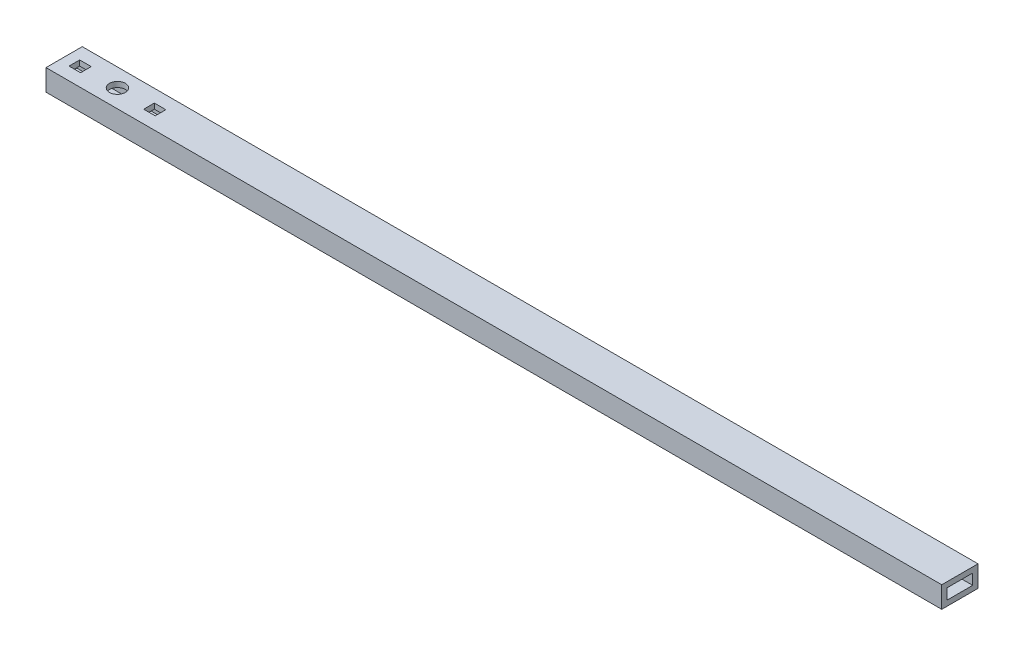
ISO-10303-21;
HEADER;
FILE_DESCRIPTION(('STEP AP214'),'2;1');
FILE_NAME('part.step','',(''),(''),'','','');
FILE_SCHEMA(('AUTOMOTIVE_DESIGN { 1 0 10303 214 1 1 1 1 }'));
ENDSEC;
DATA;
#1=APPLICATION_CONTEXT('core data for automotive mechanical design processes');
#2=APPLICATION_PROTOCOL_DEFINITION('international standard','automotive_design',2000,#1);
#3=PRODUCT_CONTEXT('',#1,'mechanical');
#4=PRODUCT('Part','Part','',(#3));
#5=PRODUCT_RELATED_PRODUCT_CATEGORY('part','',(#4));
#6=PRODUCT_DEFINITION_FORMATION('','',#4);
#7=PRODUCT_DEFINITION_CONTEXT('part definition',#1,'design');
#8=PRODUCT_DEFINITION('design','',#6,#7);
#9=PRODUCT_DEFINITION_SHAPE('','',#8);
#10=(LENGTH_UNIT() NAMED_UNIT(*) SI_UNIT(.MILLI.,.METRE.));
#11=(NAMED_UNIT(*) PLANE_ANGLE_UNIT() SI_UNIT($,.RADIAN.));
#12=(NAMED_UNIT(*) SI_UNIT($,.STERADIAN.) SOLID_ANGLE_UNIT());
#13=UNCERTAINTY_MEASURE_WITH_UNIT(LENGTH_MEASURE(1.E-05),#10,'distance_accuracy_value','');
#14=(GEOMETRIC_REPRESENTATION_CONTEXT(3) GLOBAL_UNCERTAINTY_ASSIGNED_CONTEXT((#13)) GLOBAL_UNIT_ASSIGNED_CONTEXT((#10,
#11,#12)) REPRESENTATION_CONTEXT('',''));
#15=CARTESIAN_POINT('',(0.,0.,0.));
#16=DIRECTION('',(0.,0.,1.));
#17=DIRECTION('',(1.,0.,0.));
#18=AXIS2_PLACEMENT_3D('',#15,#16,#17);
#19=CARTESIAN_POINT('',(0.,0.,0.));
#20=DIRECTION('',(-1.,0.,0.));
#21=DIRECTION('',(0.,0.,1.));
#22=AXIS2_PLACEMENT_3D('',#19,#20,#21);
#23=PLANE('',#22);
#24=DIRECTION('',(0.,1.,0.));
#25=VECTOR('',#24,1.);
#26=CARTESIAN_POINT('',(0.,-6.35,-10.795));
#27=LINE('',#26,#25);
#28=CARTESIAN_POINT('',(0.,-6.35,-10.795));
#29=VERTEX_POINT('',#28);
#30=CARTESIAN_POINT('',(0.,6.35,-10.795));
#31=VERTEX_POINT('',#30);
#32=EDGE_CURVE('E331',#29,#31,#27,.T.);
#33=ORIENTED_EDGE('',*,*,#32,.F.);
#34=DIRECTION('',(0.,0.,-1.));
#35=VECTOR('',#34,1.);
#36=CARTESIAN_POINT('',(0.,-6.35,10.795));
#37=LINE('',#36,#35);
#38=CARTESIAN_POINT('',(0.,-6.35,10.795));
#39=VERTEX_POINT('',#38);
#40=EDGE_CURVE('E339',#39,#29,#37,.T.);
#41=ORIENTED_EDGE('',*,*,#40,.F.);
#42=DIRECTION('',(0.,-1.,0.));
#43=VECTOR('',#42,1.);
#44=CARTESIAN_POINT('',(0.,-6.35,10.795));
#45=LINE('',#44,#43);
#46=CARTESIAN_POINT('',(0.,6.35,10.795));
#47=VERTEX_POINT('',#46);
#48=EDGE_CURVE('E343',#47,#39,#45,.T.);
#49=ORIENTED_EDGE('',*,*,#48,.F.);
#50=DIRECTION('',(0.,0.,1.));
#51=VECTOR('',#50,1.);
#52=CARTESIAN_POINT('',(0.,6.35,10.795));
#53=LINE('',#52,#51);
#54=EDGE_CURVE('E222',#31,#47,#53,.T.);
#55=ORIENTED_EDGE('',*,*,#54,.F.);
#56=EDGE_LOOP('',(#33,#41,#49,#55));
#57=FACE_BOUND('',#56,.T.);
#58=DIRECTION('',(0.,-1.,0.));
#59=VECTOR('',#58,1.);
#60=CARTESIAN_POINT('',(0.,-3.175,7.62));
#61=LINE('',#60,#59);
#62=CARTESIAN_POINT('',(0.,3.175,7.62));
#63=VERTEX_POINT('',#62);
#64=CARTESIAN_POINT('',(0.,-3.175,7.62));
#65=VERTEX_POINT('',#64);
#66=EDGE_CURVE('E320',#63,#65,#61,.T.);
#67=ORIENTED_EDGE('',*,*,#66,.T.);
#68=DIRECTION('',(0.,0.,-1.));
#69=VECTOR('',#68,1.);
#70=CARTESIAN_POINT('',(0.,-3.175,7.62));
#71=LINE('',#70,#69);
#72=CARTESIAN_POINT('',(0.,-3.175,-7.62));
#73=VERTEX_POINT('',#72);
#74=EDGE_CURVE('E311',#65,#73,#71,.T.);
#75=ORIENTED_EDGE('',*,*,#74,.T.);
#76=DIRECTION('',(0.,1.,0.));
#77=VECTOR('',#76,1.);
#78=CARTESIAN_POINT('',(0.,-3.175,-7.62));
#79=LINE('',#78,#77);
#80=CARTESIAN_POINT('',(0.,3.175,-7.62));
#81=VERTEX_POINT('',#80);
#82=EDGE_CURVE('E314',#73,#81,#79,.T.);
#83=ORIENTED_EDGE('',*,*,#82,.T.);
#84=DIRECTION('',(0.,0.,1.));
#85=VECTOR('',#84,1.);
#86=CARTESIAN_POINT('',(0.,3.175,7.62));
#87=LINE('',#86,#85);
#88=EDGE_CURVE('E317',#81,#63,#87,.T.);
#89=ORIENTED_EDGE('',*,*,#88,.T.);
#90=EDGE_LOOP('',(#67,#75,#83,#89));
#91=FACE_BOUND('',#90,.T.);
#92=ADVANCED_FACE('F45',(#57,#91),#23,.T.);
#93=CARTESIAN_POINT('',(596.9,-6.35,-10.795));
#94=DIRECTION('',(0.,0.,1.));
#95=DIRECTION('',(1.,0.,0.));
#96=AXIS2_PLACEMENT_3D('',#93,#94,#95);
#97=PLANE('',#96);
#98=DIRECTION('',(-1.,0.,0.));
#99=VECTOR('',#98,1.);
#100=CARTESIAN_POINT('',(596.9,6.35,-10.795));
#101=LINE('',#100,#99);
#102=CARTESIAN_POINT('',(533.4,6.35,-10.795));
#103=VERTEX_POINT('',#102);
#104=EDGE_CURVE('E224',#103,#31,#101,.T.);
#105=ORIENTED_EDGE('',*,*,#104,.F.);
#106=DIRECTION('',(0.,-1.,0.));
#107=VECTOR('',#106,1.);
#108=CARTESIAN_POINT('',(533.4,6.35,-10.795));
#109=LINE('',#108,#107);
#110=CARTESIAN_POINT('',(533.4,-6.35,-10.795));
#111=VERTEX_POINT('',#110);
#112=EDGE_CURVE('E206',#103,#111,#109,.T.);
#113=ORIENTED_EDGE('',*,*,#112,.T.);
#114=DIRECTION('',(-1.,0.,0.));
#115=VECTOR('',#114,1.);
#116=CARTESIAN_POINT('',(596.9,-6.35,-10.795));
#117=LINE('',#116,#115);
#118=EDGE_CURVE('E228',#111,#29,#117,.T.);
#119=ORIENTED_EDGE('',*,*,#118,.T.);
#120=ORIENTED_EDGE('',*,*,#32,.T.);
#121=EDGE_LOOP('',(#105,#113,#119,#120));
#122=FACE_BOUND('',#121,.T.);
#123=ADVANCED_FACE('F47',(#122),#97,.F.);
#124=CARTESIAN_POINT('',(596.9,6.35,10.795));
#125=DIRECTION('',(0.,-1.,0.));
#126=DIRECTION('',(0.,0.,-1.));
#127=AXIS2_PLACEMENT_3D('',#124,#125,#126);
#128=PLANE('',#127);
#129=DIRECTION('',(1.,0.,0.));
#130=VECTOR('',#129,1.);
#131=CARTESIAN_POINT('',(50.546,6.35,-3.175));
#132=LINE('',#131,#130);
#133=CARTESIAN_POINT('',(50.546,6.35,-3.175));
#134=VERTEX_POINT('',#133);
#135=CARTESIAN_POINT('',(57.404,6.35,-3.175));
#136=VERTEX_POINT('',#135);
#137=EDGE_CURVE('E425',#134,#136,#132,.T.);
#138=ORIENTED_EDGE('',*,*,#137,.T.);
#139=DIRECTION('',(0.,0.,1.));
#140=VECTOR('',#139,1.);
#141=CARTESIAN_POINT('',(57.404,6.35,-3.175));
#142=LINE('',#141,#140);
#143=CARTESIAN_POINT('',(57.404,6.35,3.175));
#144=VERTEX_POINT('',#143);
#145=EDGE_CURVE('E418',#136,#144,#142,.T.);
#146=ORIENTED_EDGE('',*,*,#145,.T.);
#147=DIRECTION('',(-1.,0.,0.));
#148=VECTOR('',#147,1.);
#149=CARTESIAN_POINT('',(50.546,6.35,3.175));
#150=LINE('',#149,#148);
#151=CARTESIAN_POINT('',(50.546,6.35,3.175));
#152=VERTEX_POINT('',#151);
#153=EDGE_CURVE('E421',#144,#152,#150,.T.);
#154=ORIENTED_EDGE('',*,*,#153,.T.);
#155=DIRECTION('',(0.,0.,-1.));
#156=VECTOR('',#155,1.);
#157=CARTESIAN_POINT('',(50.546,6.35,-3.175));
#158=LINE('',#157,#156);
#159=EDGE_CURVE('E275',#152,#134,#158,.T.);
#160=ORIENTED_EDGE('',*,*,#159,.T.);
#161=EDGE_LOOP('',(#138,#146,#154,#160));
#162=FACE_BOUND('',#161,.T.);
#163=DIRECTION('',(1.,0.,0.));
#164=VECTOR('',#163,1.);
#165=CARTESIAN_POINT('',(6.096,6.35,-3.175));
#166=LINE('',#165,#164);
#167=CARTESIAN_POINT('',(6.096,6.35,-3.175));
#168=VERTEX_POINT('',#167);
#169=CARTESIAN_POINT('',(12.954,6.35,-3.175));
#170=VERTEX_POINT('',#169);
#171=EDGE_CURVE('E391',#168,#170,#166,.T.);
#172=ORIENTED_EDGE('',*,*,#171,.T.);
#173=DIRECTION('',(0.,0.,1.));
#174=VECTOR('',#173,1.);
#175=CARTESIAN_POINT('',(12.954,6.35,-3.175));
#176=LINE('',#175,#174);
#177=CARTESIAN_POINT('',(12.954,6.35,3.175));
#178=VERTEX_POINT('',#177);
#179=EDGE_CURVE('E381',#170,#178,#176,.T.);
#180=ORIENTED_EDGE('',*,*,#179,.T.);
#181=DIRECTION('',(-1.,0.,0.));
#182=VECTOR('',#181,1.);
#183=CARTESIAN_POINT('',(6.096,6.35,3.175));
#184=LINE('',#183,#182);
#185=CARTESIAN_POINT('',(6.09599999999999,6.35,3.175));
#186=VERTEX_POINT('',#185);
#187=EDGE_CURVE('E384',#178,#186,#184,.T.);
#188=ORIENTED_EDGE('',*,*,#187,.T.);
#189=DIRECTION('',(0.,0.,-1.));
#190=VECTOR('',#189,1.);
#191=CARTESIAN_POINT('',(6.096,6.35,-3.175));
#192=LINE('',#191,#190);
#193=EDGE_CURVE('E388',#186,#168,#192,.T.);
#194=ORIENTED_EDGE('',*,*,#193,.T.);
#195=EDGE_LOOP('',(#172,#180,#188,#194));
#196=FACE_BOUND('',#195,.T.);
#197=CARTESIAN_POINT('',(31.75,6.35,0.));
#198=DIRECTION('',(0.,-1.,0.));
#199=DIRECTION('',(0.,0.,-1.));
#200=AXIS2_PLACEMENT_3D('',#197,#198,#199);
#201=CIRCLE('',#200,4.7244);
#202=CARTESIAN_POINT('',(31.75,6.35,-4.7244));
#203=VERTEX_POINT('',#202);
#204=EDGE_CURVE('E236',#203,#203,#201,.T.);
#205=ORIENTED_EDGE('',*,*,#204,.T.);
#206=EDGE_LOOP('',(#205));
#207=FACE_BOUND('',#206,.T.);
#208=DIRECTION('',(-1.,0.,0.));
#209=VECTOR('',#208,1.);
#210=CARTESIAN_POINT('',(596.9,6.35,10.795));
#211=LINE('',#210,#209);
#212=CARTESIAN_POINT('',(533.4,6.35,10.795));
#213=VERTEX_POINT('',#212);
#214=EDGE_CURVE('E216',#213,#47,#211,.T.);
#215=ORIENTED_EDGE('',*,*,#214,.F.);
#216=DIRECTION('',(0.,0.,-1.));
#217=VECTOR('',#216,1.);
#218=CARTESIAN_POINT('',(533.4,6.35,-10.795));
#219=LINE('',#218,#217);
#220=EDGE_CURVE('E203',#213,#103,#219,.T.);
#221=ORIENTED_EDGE('',*,*,#220,.T.);
#222=ORIENTED_EDGE('',*,*,#104,.T.);
#223=ORIENTED_EDGE('',*,*,#54,.T.);
#224=EDGE_LOOP('',(#215,#221,#222,#223));
#225=FACE_BOUND('',#224,.T.);
#226=ADVANCED_FACE('F220',(#162,#196,#207,#225),#128,.F.);
#227=CARTESIAN_POINT('',(596.9,-6.35,10.795));
#228=DIRECTION('',(0.,0.,-1.));
#229=DIRECTION('',(-1.,0.,0.));
#230=AXIS2_PLACEMENT_3D('',#227,#228,#229);
#231=PLANE('',#230);
#232=DIRECTION('',(-1.,0.,0.));
#233=VECTOR('',#232,1.);
#234=CARTESIAN_POINT('',(596.9,-6.35,10.795));
#235=LINE('',#234,#233);
#236=CARTESIAN_POINT('',(533.4,-6.35,10.795));
#237=VERTEX_POINT('',#236);
#238=EDGE_CURVE('E218',#237,#39,#235,.T.);
#239=ORIENTED_EDGE('',*,*,#238,.F.);
#240=DIRECTION('',(0.,-1.,0.));
#241=VECTOR('',#240,1.);
#242=CARTESIAN_POINT('',(533.4,6.35,10.795));
#243=LINE('',#242,#241);
#244=EDGE_CURVE('E60',#213,#237,#243,.T.);
#245=ORIENTED_EDGE('',*,*,#244,.F.);
#246=ORIENTED_EDGE('',*,*,#214,.T.);
#247=ORIENTED_EDGE('',*,*,#48,.T.);
#248=EDGE_LOOP('',(#239,#245,#246,#247));
#249=FACE_BOUND('',#248,.T.);
#250=ADVANCED_FACE('F214',(#249),#231,.F.);
#251=CARTESIAN_POINT('',(596.9,-6.35,10.795));
#252=DIRECTION('',(0.,1.,0.));
#253=DIRECTION('',(0.,0.,1.));
#254=AXIS2_PLACEMENT_3D('',#251,#252,#253);
#255=PLANE('',#254);
#256=DIRECTION('',(-1.,0.,0.));
#257=VECTOR('',#256,1.);
#258=CARTESIAN_POINT('',(50.546,-6.35,3.175));
#259=LINE('',#258,#257);
#260=CARTESIAN_POINT('',(57.404,-6.35,3.175));
#261=VERTEX_POINT('',#260);
#262=CARTESIAN_POINT('',(50.546,-6.35,3.175));
#263=VERTEX_POINT('',#262);
#264=EDGE_CURVE('E429',#261,#263,#259,.T.);
#265=ORIENTED_EDGE('',*,*,#264,.F.);
#266=DIRECTION('',(0.,0.,1.));
#267=VECTOR('',#266,1.);
#268=CARTESIAN_POINT('',(57.404,-6.35,-3.175));
#269=LINE('',#268,#267);
#270=CARTESIAN_POINT('',(57.404,-6.35,-3.175));
#271=VERTEX_POINT('',#270);
#272=EDGE_CURVE('E380',#271,#261,#269,.T.);
#273=ORIENTED_EDGE('',*,*,#272,.F.);
#274=DIRECTION('',(1.,0.,0.));
#275=VECTOR('',#274,1.);
#276=CARTESIAN_POINT('',(50.546,-6.35,-3.175));
#277=LINE('',#276,#275);
#278=CARTESIAN_POINT('',(50.546,-6.35,-3.175));
#279=VERTEX_POINT('',#278);
#280=EDGE_CURVE('E422',#279,#271,#277,.T.);
#281=ORIENTED_EDGE('',*,*,#280,.F.);
#282=DIRECTION('',(0.,0.,-1.));
#283=VECTOR('',#282,1.);
#284=CARTESIAN_POINT('',(50.546,-6.35,-3.175));
#285=LINE('',#284,#283);
#286=EDGE_CURVE('E432',#263,#279,#285,.T.);
#287=ORIENTED_EDGE('',*,*,#286,.F.);
#288=EDGE_LOOP('',(#265,#273,#281,#287));
#289=FACE_BOUND('',#288,.T.);
#290=DIRECTION('',(-1.,0.,0.));
#291=VECTOR('',#290,1.);
#292=CARTESIAN_POINT('',(6.096,-6.35,3.175));
#293=LINE('',#292,#291);
#294=CARTESIAN_POINT('',(12.954,-6.35,3.175));
#295=VERTEX_POINT('',#294);
#296=CARTESIAN_POINT('',(6.096,-6.35,3.175));
#297=VERTEX_POINT('',#296);
#298=EDGE_CURVE('E397',#295,#297,#293,.T.);
#299=ORIENTED_EDGE('',*,*,#298,.F.);
#300=DIRECTION('',(0.,0.,1.));
#301=VECTOR('',#300,1.);
#302=CARTESIAN_POINT('',(12.954,-6.35,-3.175));
#303=LINE('',#302,#301);
#304=CARTESIAN_POINT('',(12.954,-6.35,-3.175));
#305=VERTEX_POINT('',#304);
#306=EDGE_CURVE('E395',#305,#295,#303,.T.);
#307=ORIENTED_EDGE('',*,*,#306,.F.);
#308=DIRECTION('',(1.,0.,0.));
#309=VECTOR('',#308,1.);
#310=CARTESIAN_POINT('',(6.096,-6.35,-3.175));
#311=LINE('',#310,#309);
#312=CARTESIAN_POINT('',(6.096,-6.35,-3.175));
#313=VERTEX_POINT('',#312);
#314=EDGE_CURVE('E385',#313,#305,#311,.T.);
#315=ORIENTED_EDGE('',*,*,#314,.F.);
#316=DIRECTION('',(0.,0.,-1.));
#317=VECTOR('',#316,1.);
#318=CARTESIAN_POINT('',(6.096,-6.35,-3.175));
#319=LINE('',#318,#317);
#320=EDGE_CURVE('E400',#297,#313,#319,.T.);
#321=ORIENTED_EDGE('',*,*,#320,.F.);
#322=EDGE_LOOP('',(#299,#307,#315,#321));
#323=FACE_BOUND('',#322,.T.);
#324=CARTESIAN_POINT('',(31.75,-6.35,0.));
#325=DIRECTION('',(0.,-1.,0.));
#326=DIRECTION('',(0.,0.,-1.));
#327=AXIS2_PLACEMENT_3D('',#324,#325,#326);
#328=CIRCLE('',#327,4.7244);
#329=CARTESIAN_POINT('',(31.75,-6.35,-4.7244));
#330=VERTEX_POINT('',#329);
#331=EDGE_CURVE('E287',#330,#330,#328,.T.);
#332=ORIENTED_EDGE('',*,*,#331,.F.);
#333=EDGE_LOOP('',(#332));
#334=FACE_BOUND('',#333,.T.);
#335=ORIENTED_EDGE('',*,*,#118,.F.);
#336=DIRECTION('',(0.,0.,-1.));
#337=VECTOR('',#336,1.);
#338=CARTESIAN_POINT('',(533.4,-6.35,-10.795));
#339=LINE('',#338,#337);
#340=EDGE_CURVE('E210',#237,#111,#339,.T.);
#341=ORIENTED_EDGE('',*,*,#340,.F.);
#342=ORIENTED_EDGE('',*,*,#238,.T.);
#343=ORIENTED_EDGE('',*,*,#40,.T.);
#344=EDGE_LOOP('',(#335,#341,#342,#343));
#345=FACE_BOUND('',#344,.T.);
#346=ADVANCED_FACE('F349',(#289,#323,#334,#345),#255,.F.);
#347=CARTESIAN_POINT('',(596.9,-3.175,7.62));
#348=DIRECTION('',(0.,1.,0.));
#349=DIRECTION('',(0.,0.,1.));
#350=AXIS2_PLACEMENT_3D('',#347,#348,#349);
#351=PLANE('',#350);
#352=DIRECTION('',(0.,0.,1.));
#353=VECTOR('',#352,1.);
#354=CARTESIAN_POINT('',(533.4,-3.175,7.62));
#355=LINE('',#354,#353);
#356=CARTESIAN_POINT('',(533.4,-3.175,-7.62));
#357=VERTEX_POINT('',#356);
#358=CARTESIAN_POINT('',(533.4,-3.175,7.62));
#359=VERTEX_POINT('',#358);
#360=EDGE_CURVE('E67',#357,#359,#355,.T.);
#361=ORIENTED_EDGE('',*,*,#360,.F.);
#362=DIRECTION('',(-1.,0.,0.));
#363=VECTOR('',#362,1.);
#364=CARTESIAN_POINT('',(596.9,-3.175,-7.62));
#365=LINE('',#364,#363);
#366=EDGE_CURVE('E329',#357,#73,#365,.T.);
#367=ORIENTED_EDGE('',*,*,#366,.T.);
#368=ORIENTED_EDGE('',*,*,#74,.F.);
#369=DIRECTION('',(-1.,0.,0.));
#370=VECTOR('',#369,1.);
#371=CARTESIAN_POINT('',(596.9,-3.175,7.62));
#372=LINE('',#371,#370);
#373=EDGE_CURVE('E323',#359,#65,#372,.T.);
#374=ORIENTED_EDGE('',*,*,#373,.F.);
#375=EDGE_LOOP('',(#361,#367,#368,#374));
#376=FACE_BOUND('',#375,.T.);
#377=DIRECTION('',(0.,0.,-1.));
#378=VECTOR('',#377,1.);
#379=CARTESIAN_POINT('',(57.404,-3.175,7.62));
#380=LINE('',#379,#378);
#381=CARTESIAN_POINT('',(57.404,-3.175,3.175));
#382=VERTEX_POINT('',#381);
#383=CARTESIAN_POINT('',(57.404,-3.175,-3.175));
#384=VERTEX_POINT('',#383);
#385=EDGE_CURVE('E309',#382,#384,#380,.T.);
#386=ORIENTED_EDGE('',*,*,#385,.F.);
#387=DIRECTION('',(1.,0.,0.));
#388=VECTOR('',#387,1.);
#389=CARTESIAN_POINT('',(596.9,-3.175,3.17499999999997));
#390=LINE('',#389,#388);
#391=CARTESIAN_POINT('',(50.546,-3.175,3.175));
#392=VERTEX_POINT('',#391);
#393=EDGE_CURVE('E302',#392,#382,#390,.T.);
#394=ORIENTED_EDGE('',*,*,#393,.F.);
#395=DIRECTION('',(0.,0.,1.));
#396=VECTOR('',#395,1.);
#397=CARTESIAN_POINT('',(50.546,-3.175,7.62));
#398=LINE('',#397,#396);
#399=CARTESIAN_POINT('',(50.546,-3.175,-3.175));
#400=VERTEX_POINT('',#399);
#401=EDGE_CURVE('E304',#400,#392,#398,.T.);
#402=ORIENTED_EDGE('',*,*,#401,.F.);
#403=DIRECTION('',(-1.,0.,0.));
#404=VECTOR('',#403,1.);
#405=CARTESIAN_POINT('',(596.9,-3.175,-3.17499999999997));
#406=LINE('',#405,#404);
#407=EDGE_CURVE('E307',#384,#400,#406,.T.);
#408=ORIENTED_EDGE('',*,*,#407,.F.);
#409=EDGE_LOOP('',(#386,#394,#402,#408));
#410=FACE_BOUND('',#409,.T.);
#411=DIRECTION('',(0.,0.,-1.));
#412=VECTOR('',#411,1.);
#413=CARTESIAN_POINT('',(12.954,-3.175,7.62));
#414=LINE('',#413,#412);
#415=CARTESIAN_POINT('',(12.954,-3.175,3.175));
#416=VERTEX_POINT('',#415);
#417=CARTESIAN_POINT('',(12.954,-3.175,-3.175));
#418=VERTEX_POINT('',#417);
#419=EDGE_CURVE('E300',#416,#418,#414,.T.);
#420=ORIENTED_EDGE('',*,*,#419,.F.);
#421=DIRECTION('',(1.,0.,0.));
#422=VECTOR('',#421,1.);
#423=CARTESIAN_POINT('',(596.9,-3.175,3.17500000000011));
#424=LINE('',#423,#422);
#425=CARTESIAN_POINT('',(6.09599999999999,-3.175,3.175));
#426=VERTEX_POINT('',#425);
#427=EDGE_CURVE('E293',#426,#416,#424,.T.);
#428=ORIENTED_EDGE('',*,*,#427,.F.);
#429=DIRECTION('',(0.,0.,1.));
#430=VECTOR('',#429,1.);
#431=CARTESIAN_POINT('',(6.09599999999999,-3.175,7.62));
#432=LINE('',#431,#430);
#433=CARTESIAN_POINT('',(6.096,-3.175,-3.175));
#434=VERTEX_POINT('',#433);
#435=EDGE_CURVE('E295',#434,#426,#432,.T.);
#436=ORIENTED_EDGE('',*,*,#435,.F.);
#437=DIRECTION('',(-1.,0.,0.));
#438=VECTOR('',#437,1.);
#439=CARTESIAN_POINT('',(596.9,-3.175,-3.17499999999996));
#440=LINE('',#439,#438);
#441=EDGE_CURVE('E298',#418,#434,#440,.T.);
#442=ORIENTED_EDGE('',*,*,#441,.F.);
#443=EDGE_LOOP('',(#420,#428,#436,#442));
#444=FACE_BOUND('',#443,.T.);
#445=CARTESIAN_POINT('',(31.75,-3.175,0.));
#446=DIRECTION('',(0.,1.,0.));
#447=DIRECTION('',(0.,0.,1.));
#448=AXIS2_PLACEMENT_3D('',#445,#446,#447);
#449=CIRCLE('',#448,4.7244);
#450=CARTESIAN_POINT('',(31.75,-3.175,4.7244));
#451=VERTEX_POINT('',#450);
#452=EDGE_CURVE('E235',#451,#451,#449,.T.);
#453=ORIENTED_EDGE('',*,*,#452,.F.);
#454=EDGE_LOOP('',(#453));
#455=FACE_BOUND('',#454,.T.);
#456=ADVANCED_FACE('F363',(#376,#410,#444,#455),#351,.T.);
#457=CARTESIAN_POINT('',(596.9,-3.175,-7.62));
#458=DIRECTION('',(0.,0.,1.));
#459=DIRECTION('',(0.,-1.,0.));
#460=AXIS2_PLACEMENT_3D('',#457,#458,#459);
#461=PLANE('',#460);
#462=DIRECTION('',(0.,-1.,0.));
#463=VECTOR('',#462,1.);
#464=CARTESIAN_POINT('',(533.4,-3.175,-7.62));
#465=LINE('',#464,#463);
#466=CARTESIAN_POINT('',(533.4,3.175,-7.62));
#467=VERTEX_POINT('',#466);
#468=EDGE_CURVE('E371',#467,#357,#465,.T.);
#469=ORIENTED_EDGE('',*,*,#468,.F.);
#470=DIRECTION('',(-1.,0.,0.));
#471=VECTOR('',#470,1.);
#472=CARTESIAN_POINT('',(596.9,3.175,-7.62));
#473=LINE('',#472,#471);
#474=EDGE_CURVE('E327',#467,#81,#473,.T.);
#475=ORIENTED_EDGE('',*,*,#474,.T.);
#476=ORIENTED_EDGE('',*,*,#82,.F.);
#477=ORIENTED_EDGE('',*,*,#366,.F.);
#478=EDGE_LOOP('',(#469,#475,#476,#477));
#479=FACE_BOUND('',#478,.T.);
#480=ADVANCED_FACE('F369',(#479),#461,.T.);
#481=CARTESIAN_POINT('',(596.9,3.175,7.62));
#482=DIRECTION('',(0.,-1.,0.));
#483=DIRECTION('',(0.,0.,-1.));
#484=AXIS2_PLACEMENT_3D('',#481,#482,#483);
#485=PLANE('',#484);
#486=DIRECTION('',(0.,0.,-1.));
#487=VECTOR('',#486,1.);
#488=CARTESIAN_POINT('',(533.4,3.175,7.62));
#489=LINE('',#488,#487);
#490=CARTESIAN_POINT('',(533.4,3.175,7.62));
#491=VERTEX_POINT('',#490);
#492=EDGE_CURVE('E374',#491,#467,#489,.T.);
#493=ORIENTED_EDGE('',*,*,#492,.F.);
#494=DIRECTION('',(-1.,0.,0.));
#495=VECTOR('',#494,1.);
#496=CARTESIAN_POINT('',(596.9,3.175,7.62));
#497=LINE('',#496,#495);
#498=EDGE_CURVE('E325',#491,#63,#497,.T.);
#499=ORIENTED_EDGE('',*,*,#498,.T.);
#500=ORIENTED_EDGE('',*,*,#88,.F.);
#501=ORIENTED_EDGE('',*,*,#474,.F.);
#502=EDGE_LOOP('',(#493,#499,#500,#501));
#503=FACE_BOUND('',#502,.T.);
#504=DIRECTION('',(0.,0.,1.));
#505=VECTOR('',#504,1.);
#506=CARTESIAN_POINT('',(57.404,3.175,7.62));
#507=LINE('',#506,#505);
#508=CARTESIAN_POINT('',(57.404,3.175,-3.175));
#509=VERTEX_POINT('',#508);
#510=CARTESIAN_POINT('',(57.404,3.175,3.175));
#511=VERTEX_POINT('',#510);
#512=EDGE_CURVE('E53',#509,#511,#507,.T.);
#513=ORIENTED_EDGE('',*,*,#512,.F.);
#514=DIRECTION('',(1.,0.,0.));
#515=VECTOR('',#514,1.);
#516=CARTESIAN_POINT('',(596.9,3.175,-3.17499999999997));
#517=LINE('',#516,#515);
#518=CARTESIAN_POINT('',(50.546,3.175,-3.175));
#519=VERTEX_POINT('',#518);
#520=EDGE_CURVE('E249',#519,#509,#517,.T.);
#521=ORIENTED_EDGE('',*,*,#520,.F.);
#522=DIRECTION('',(0.,0.,-1.));
#523=VECTOR('',#522,1.);
#524=CARTESIAN_POINT('',(50.546,3.175,7.62));
#525=LINE('',#524,#523);
#526=CARTESIAN_POINT('',(50.546,3.175,3.175));
#527=VERTEX_POINT('',#526);
#528=EDGE_CURVE('E247',#527,#519,#525,.T.);
#529=ORIENTED_EDGE('',*,*,#528,.F.);
#530=DIRECTION('',(-1.,0.,0.));
#531=VECTOR('',#530,1.);
#532=CARTESIAN_POINT('',(596.9,3.175,3.17499999999997));
#533=LINE('',#532,#531);
#534=EDGE_CURVE('E245',#511,#527,#533,.T.);
#535=ORIENTED_EDGE('',*,*,#534,.F.);
#536=EDGE_LOOP('',(#513,#521,#529,#535));
#537=FACE_BOUND('',#536,.T.);
#538=DIRECTION('',(0.,0.,1.));
#539=VECTOR('',#538,1.);
#540=CARTESIAN_POINT('',(12.954,3.175,7.62));
#541=LINE('',#540,#539);
#542=CARTESIAN_POINT('',(12.954,3.175,-3.175));
#543=VERTEX_POINT('',#542);
#544=CARTESIAN_POINT('',(12.954,3.175,3.175));
#545=VERTEX_POINT('',#544);
#546=EDGE_CURVE('E242',#543,#545,#541,.T.);
#547=ORIENTED_EDGE('',*,*,#546,.F.);
#548=DIRECTION('',(1.,0.,0.));
#549=VECTOR('',#548,1.);
#550=CARTESIAN_POINT('',(596.9,3.175,-3.17499999999996));
#551=LINE('',#550,#549);
#552=CARTESIAN_POINT('',(6.096,3.175,-3.175));
#553=VERTEX_POINT('',#552);
#554=EDGE_CURVE('E240',#553,#543,#551,.T.);
#555=ORIENTED_EDGE('',*,*,#554,.F.);
#556=DIRECTION('',(0.,0.,-1.));
#557=VECTOR('',#556,1.);
#558=CARTESIAN_POINT('',(6.09599999999999,3.175,7.62));
#559=LINE('',#558,#557);
#560=CARTESIAN_POINT('',(6.096,3.175,3.175));
#561=VERTEX_POINT('',#560);
#562=EDGE_CURVE('E238',#561,#553,#559,.T.);
#563=ORIENTED_EDGE('',*,*,#562,.F.);
#564=DIRECTION('',(-1.,0.,0.));
#565=VECTOR('',#564,1.);
#566=CARTESIAN_POINT('',(596.9,3.175,3.17500000000011));
#567=LINE('',#566,#565);
#568=EDGE_CURVE('E226',#545,#561,#567,.T.);
#569=ORIENTED_EDGE('',*,*,#568,.F.);
#570=EDGE_LOOP('',(#547,#555,#563,#569));
#571=FACE_BOUND('',#570,.T.);
#572=CARTESIAN_POINT('',(31.75,3.175,0.));
#573=DIRECTION('',(0.,-1.,0.));
#574=DIRECTION('',(0.,0.,-1.));
#575=AXIS2_PLACEMENT_3D('',#572,#573,#574);
#576=CIRCLE('',#575,4.7244);
#577=CARTESIAN_POINT('',(31.75,3.175,-4.7244));
#578=VERTEX_POINT('',#577);
#579=EDGE_CURVE('E232',#578,#578,#576,.T.);
#580=ORIENTED_EDGE('',*,*,#579,.F.);
#581=EDGE_LOOP('',(#580));
#582=FACE_BOUND('',#581,.T.);
#583=ADVANCED_FACE('F263',(#503,#537,#571,#582),#485,.T.);
#584=CARTESIAN_POINT('',(596.9,-3.175,7.62));
#585=DIRECTION('',(0.,0.,-1.));
#586=DIRECTION('',(-1.,0.,0.));
#587=AXIS2_PLACEMENT_3D('',#584,#585,#586);
#588=PLANE('',#587);
#589=DIRECTION('',(0.,1.,0.));
#590=VECTOR('',#589,1.);
#591=CARTESIAN_POINT('',(533.4,-3.175,7.62));
#592=LINE('',#591,#590);
#593=EDGE_CURVE('E12',#359,#491,#592,.T.);
#594=ORIENTED_EDGE('',*,*,#593,.F.);
#595=ORIENTED_EDGE('',*,*,#373,.T.);
#596=ORIENTED_EDGE('',*,*,#66,.F.);
#597=ORIENTED_EDGE('',*,*,#498,.F.);
#598=EDGE_LOOP('',(#594,#595,#596,#597));
#599=FACE_BOUND('',#598,.T.);
#600=ADVANCED_FACE('F360',(#599),#588,.T.);
#601=CARTESIAN_POINT('',(31.75,6.35,0.));
#602=DIRECTION('',(0.,-1.,0.));
#603=DIRECTION('',(0.,0.,-1.));
#604=AXIS2_PLACEMENT_3D('',#601,#602,#603);
#605=CYLINDRICAL_SURFACE('',#604,4.7244);
#606=ORIENTED_EDGE('',*,*,#579,.T.);
#607=EDGE_LOOP('',(#606));
#608=FACE_BOUND('',#607,.T.);
#609=ORIENTED_EDGE('',*,*,#204,.F.);
#610=EDGE_LOOP('',(#609));
#611=FACE_BOUND('',#610,.T.);
#612=ADVANCED_FACE('F449',(#608,#611),#605,.F.);
#613=CARTESIAN_POINT('',(6.096,6.35,3.175));
#614=DIRECTION('',(0.,0.,1.));
#615=DIRECTION('',(1.,0.,0.));
#616=AXIS2_PLACEMENT_3D('',#613,#614,#615);
#617=PLANE('',#616);
#618=ORIENTED_EDGE('',*,*,#568,.T.);
#619=DIRECTION('',(0.,-1.,0.));
#620=VECTOR('',#619,1.);
#621=CARTESIAN_POINT('',(6.096,6.35,3.175));
#622=LINE('',#621,#620);
#623=EDGE_CURVE('E412',#186,#561,#622,.T.);
#624=ORIENTED_EDGE('',*,*,#623,.F.);
#625=ORIENTED_EDGE('',*,*,#187,.F.);
#626=DIRECTION('',(0.,-1.,0.));
#627=VECTOR('',#626,1.);
#628=CARTESIAN_POINT('',(12.954,6.35,3.175));
#629=LINE('',#628,#627);
#630=EDGE_CURVE('E416',#178,#545,#629,.T.);
#631=ORIENTED_EDGE('',*,*,#630,.T.);
#632=EDGE_LOOP('',(#618,#624,#625,#631));
#633=FACE_BOUND('',#632,.T.);
#634=ADVANCED_FACE('F451',(#633),#617,.F.);
#635=CARTESIAN_POINT('',(6.096,6.35,-3.175));
#636=DIRECTION('',(-1.,0.,0.));
#637=DIRECTION('',(0.,0.,1.));
#638=AXIS2_PLACEMENT_3D('',#635,#636,#637);
#639=PLANE('',#638);
#640=ORIENTED_EDGE('',*,*,#562,.T.);
#641=DIRECTION('',(0.,-1.,0.));
#642=VECTOR('',#641,1.);
#643=CARTESIAN_POINT('',(6.096,6.35,-3.175));
#644=LINE('',#643,#642);
#645=EDGE_CURVE('E408',#168,#553,#644,.T.);
#646=ORIENTED_EDGE('',*,*,#645,.F.);
#647=ORIENTED_EDGE('',*,*,#193,.F.);
#648=ORIENTED_EDGE('',*,*,#623,.T.);
#649=EDGE_LOOP('',(#640,#646,#647,#648));
#650=FACE_BOUND('',#649,.T.);
#651=ADVANCED_FACE('F459',(#650),#639,.F.);
#652=CARTESIAN_POINT('',(6.096,6.35,-3.175));
#653=DIRECTION('',(0.,0.,-1.));
#654=DIRECTION('',(-1.,0.,0.));
#655=AXIS2_PLACEMENT_3D('',#652,#653,#654);
#656=PLANE('',#655);
#657=ORIENTED_EDGE('',*,*,#554,.T.);
#658=DIRECTION('',(0.,-1.,0.));
#659=VECTOR('',#658,1.);
#660=CARTESIAN_POINT('',(12.954,6.35,-3.175));
#661=LINE('',#660,#659);
#662=EDGE_CURVE('E290',#170,#543,#661,.T.);
#663=ORIENTED_EDGE('',*,*,#662,.F.);
#664=ORIENTED_EDGE('',*,*,#171,.F.);
#665=ORIENTED_EDGE('',*,*,#645,.T.);
#666=EDGE_LOOP('',(#657,#663,#664,#665));
#667=FACE_BOUND('',#666,.T.);
#668=ADVANCED_FACE('F578',(#667),#656,.F.);
#669=CARTESIAN_POINT('',(12.954,6.35,-3.175));
#670=DIRECTION('',(1.,0.,0.));
#671=DIRECTION('',(0.,0.,-1.));
#672=AXIS2_PLACEMENT_3D('',#669,#670,#671);
#673=PLANE('',#672);
#674=ORIENTED_EDGE('',*,*,#546,.T.);
#675=ORIENTED_EDGE('',*,*,#630,.F.);
#676=ORIENTED_EDGE('',*,*,#179,.F.);
#677=ORIENTED_EDGE('',*,*,#662,.T.);
#678=EDGE_LOOP('',(#674,#675,#676,#677));
#679=FACE_BOUND('',#678,.T.);
#680=ADVANCED_FACE('F475',(#679),#673,.F.);
#681=CARTESIAN_POINT('',(50.546,6.35,3.175));
#682=DIRECTION('',(0.,0.,1.));
#683=DIRECTION('',(1.,0.,0.));
#684=AXIS2_PLACEMENT_3D('',#681,#682,#683);
#685=PLANE('',#684);
#686=ORIENTED_EDGE('',*,*,#534,.T.);
#687=DIRECTION('',(0.,-1.,0.));
#688=VECTOR('',#687,1.);
#689=CARTESIAN_POINT('',(50.546,6.35,3.175));
#690=LINE('',#689,#688);
#691=EDGE_CURVE('E269',#152,#527,#690,.T.);
#692=ORIENTED_EDGE('',*,*,#691,.F.);
#693=ORIENTED_EDGE('',*,*,#153,.F.);
#694=DIRECTION('',(0.,-1.,0.));
#695=VECTOR('',#694,1.);
#696=CARTESIAN_POINT('',(57.404,6.35,3.175));
#697=LINE('',#696,#695);
#698=EDGE_CURVE('E257',#144,#511,#697,.T.);
#699=ORIENTED_EDGE('',*,*,#698,.T.);
#700=EDGE_LOOP('',(#686,#692,#693,#699));
#701=FACE_BOUND('',#700,.T.);
#702=ADVANCED_FACE('F268',(#701),#685,.F.);
#703=CARTESIAN_POINT('',(50.546,6.35,-3.175));
#704=DIRECTION('',(-1.,0.,0.));
#705=DIRECTION('',(0.,0.,1.));
#706=AXIS2_PLACEMENT_3D('',#703,#704,#705);
#707=PLANE('',#706);
#708=ORIENTED_EDGE('',*,*,#528,.T.);
#709=DIRECTION('',(0.,-1.,0.));
#710=VECTOR('',#709,1.);
#711=CARTESIAN_POINT('',(50.546,6.35,-3.175));
#712=LINE('',#711,#710);
#713=EDGE_CURVE('E279',#134,#519,#712,.T.);
#714=ORIENTED_EDGE('',*,*,#713,.F.);
#715=ORIENTED_EDGE('',*,*,#159,.F.);
#716=ORIENTED_EDGE('',*,*,#691,.T.);
#717=EDGE_LOOP('',(#708,#714,#715,#716));
#718=FACE_BOUND('',#717,.T.);
#719=ADVANCED_FACE('F272',(#718),#707,.F.);
#720=CARTESIAN_POINT('',(50.546,6.35,-3.175));
#721=DIRECTION('',(0.,0.,-1.));
#722=DIRECTION('',(-1.,0.,0.));
#723=AXIS2_PLACEMENT_3D('',#720,#721,#722);
#724=PLANE('',#723);
#725=ORIENTED_EDGE('',*,*,#520,.T.);
#726=DIRECTION('',(0.,-1.,0.));
#727=VECTOR('',#726,1.);
#728=CARTESIAN_POINT('',(57.404,6.35,-3.175));
#729=LINE('',#728,#727);
#730=EDGE_CURVE('E259',#136,#509,#729,.T.);
#731=ORIENTED_EDGE('',*,*,#730,.F.);
#732=ORIENTED_EDGE('',*,*,#137,.F.);
#733=ORIENTED_EDGE('',*,*,#713,.T.);
#734=EDGE_LOOP('',(#725,#731,#732,#733));
#735=FACE_BOUND('',#734,.T.);
#736=ADVANCED_FACE('F441',(#735),#724,.F.);
#737=CARTESIAN_POINT('',(57.404,6.35,-3.175));
#738=DIRECTION('',(1.,0.,0.));
#739=DIRECTION('',(0.,0.,-1.));
#740=AXIS2_PLACEMENT_3D('',#737,#738,#739);
#741=PLANE('',#740);
#742=ORIENTED_EDGE('',*,*,#512,.T.);
#743=ORIENTED_EDGE('',*,*,#698,.F.);
#744=ORIENTED_EDGE('',*,*,#145,.F.);
#745=ORIENTED_EDGE('',*,*,#730,.T.);
#746=EDGE_LOOP('',(#742,#743,#744,#745));
#747=FACE_BOUND('',#746,.T.);
#748=ADVANCED_FACE('F255',(#747),#741,.F.);
#749=ORIENTED_EDGE('',*,*,#452,.T.);
#750=EDGE_LOOP('',(#749));
#751=FACE_BOUND('',#750,.T.);
#752=ORIENTED_EDGE('',*,*,#331,.T.);
#753=EDGE_LOOP('',(#752));
#754=FACE_BOUND('',#753,.T.);
#755=ADVANCED_FACE('F454',(#751,#754),#605,.F.);
#756=ORIENTED_EDGE('',*,*,#419,.T.);
#757=EDGE_CURVE('E407',#418,#305,#661,.T.);
#758=ORIENTED_EDGE('',*,*,#757,.T.);
#759=ORIENTED_EDGE('',*,*,#306,.T.);
#760=EDGE_CURVE('E394',#416,#295,#629,.T.);
#761=ORIENTED_EDGE('',*,*,#760,.F.);
#762=EDGE_LOOP('',(#756,#758,#759,#761));
#763=FACE_BOUND('',#762,.T.);
#764=ADVANCED_FACE('F466',(#763),#673,.F.);
#765=ORIENTED_EDGE('',*,*,#441,.T.);
#766=EDGE_CURVE('E411',#434,#313,#644,.T.);
#767=ORIENTED_EDGE('',*,*,#766,.T.);
#768=ORIENTED_EDGE('',*,*,#314,.T.);
#769=ORIENTED_EDGE('',*,*,#757,.F.);
#770=EDGE_LOOP('',(#765,#767,#768,#769));
#771=FACE_BOUND('',#770,.T.);
#772=ADVANCED_FACE('F472',(#771),#656,.F.);
#773=ORIENTED_EDGE('',*,*,#435,.T.);
#774=EDGE_CURVE('E415',#426,#297,#622,.T.);
#775=ORIENTED_EDGE('',*,*,#774,.T.);
#776=ORIENTED_EDGE('',*,*,#320,.T.);
#777=ORIENTED_EDGE('',*,*,#766,.F.);
#778=EDGE_LOOP('',(#773,#775,#776,#777));
#779=FACE_BOUND('',#778,.T.);
#780=ADVANCED_FACE('F581',(#779),#639,.F.);
#781=ORIENTED_EDGE('',*,*,#427,.T.);
#782=ORIENTED_EDGE('',*,*,#760,.T.);
#783=ORIENTED_EDGE('',*,*,#298,.T.);
#784=ORIENTED_EDGE('',*,*,#774,.F.);
#785=EDGE_LOOP('',(#781,#782,#783,#784));
#786=FACE_BOUND('',#785,.T.);
#787=ADVANCED_FACE('F462',(#786),#617,.F.);
#788=ORIENTED_EDGE('',*,*,#385,.T.);
#789=EDGE_CURVE('E436',#384,#271,#729,.T.);
#790=ORIENTED_EDGE('',*,*,#789,.T.);
#791=ORIENTED_EDGE('',*,*,#272,.T.);
#792=EDGE_CURVE('E284',#382,#261,#697,.T.);
#793=ORIENTED_EDGE('',*,*,#792,.F.);
#794=EDGE_LOOP('',(#788,#790,#791,#793));
#795=FACE_BOUND('',#794,.T.);
#796=ADVANCED_FACE('F476',(#795),#741,.F.);
#797=ORIENTED_EDGE('',*,*,#407,.T.);
#798=EDGE_CURVE('E276',#400,#279,#712,.T.);
#799=ORIENTED_EDGE('',*,*,#798,.T.);
#800=ORIENTED_EDGE('',*,*,#280,.T.);
#801=ORIENTED_EDGE('',*,*,#789,.F.);
#802=EDGE_LOOP('',(#797,#799,#800,#801));
#803=FACE_BOUND('',#802,.T.);
#804=ADVANCED_FACE('F624',(#803),#724,.F.);
#805=ORIENTED_EDGE('',*,*,#401,.T.);
#806=EDGE_CURVE('E277',#392,#263,#690,.T.);
#807=ORIENTED_EDGE('',*,*,#806,.T.);
#808=ORIENTED_EDGE('',*,*,#286,.T.);
#809=ORIENTED_EDGE('',*,*,#798,.F.);
#810=EDGE_LOOP('',(#805,#807,#808,#809));
#811=FACE_BOUND('',#810,.T.);
#812=ADVANCED_FACE('F615',(#811),#707,.F.);
#813=ORIENTED_EDGE('',*,*,#393,.T.);
#814=ORIENTED_EDGE('',*,*,#792,.T.);
#815=ORIENTED_EDGE('',*,*,#264,.T.);
#816=ORIENTED_EDGE('',*,*,#806,.F.);
#817=EDGE_LOOP('',(#813,#814,#815,#816));
#818=FACE_BOUND('',#817,.T.);
#819=ADVANCED_FACE('F514',(#818),#685,.F.);
#820=CARTESIAN_POINT('',(533.4,6.35,-10.795));
#821=DIRECTION('',(-1.,0.,0.));
#822=DIRECTION('',(0.,0.,1.));
#823=AXIS2_PLACEMENT_3D('',#820,#821,#822);
#824=PLANE('',#823);
#825=ORIENTED_EDGE('',*,*,#360,.T.);
#826=ORIENTED_EDGE('',*,*,#593,.T.);
#827=ORIENTED_EDGE('',*,*,#492,.T.);
#828=ORIENTED_EDGE('',*,*,#468,.T.);
#829=EDGE_LOOP('',(#825,#826,#827,#828));
#830=FACE_BOUND('',#829,.T.);
#831=ORIENTED_EDGE('',*,*,#340,.T.);
#832=ORIENTED_EDGE('',*,*,#112,.F.);
#833=ORIENTED_EDGE('',*,*,#220,.F.);
#834=ORIENTED_EDGE('',*,*,#244,.T.);
#835=EDGE_LOOP('',(#831,#832,#833,#834));
#836=FACE_BOUND('',#835,.T.);
#837=ADVANCED_FACE('F204',(#830,#836),#824,.F.);
#838=CLOSED_SHELL('',(#92,#123,#226,#250,#346,#456,#480,#583,#600,#612,#634,#651,#668,#680,#702,
#719,#736,#748,#755,#764,#772,#780,#787,#796,#804,#812,#819,#837));
#839=MANIFOLD_SOLID_BREP('B2',#838);
#840=ADVANCED_BREP_SHAPE_REPRESENTATION('',(#18,#839),#14);
#841=SHAPE_DEFINITION_REPRESENTATION(#9,#840);
ENDSEC;
END-ISO-10303-21;
